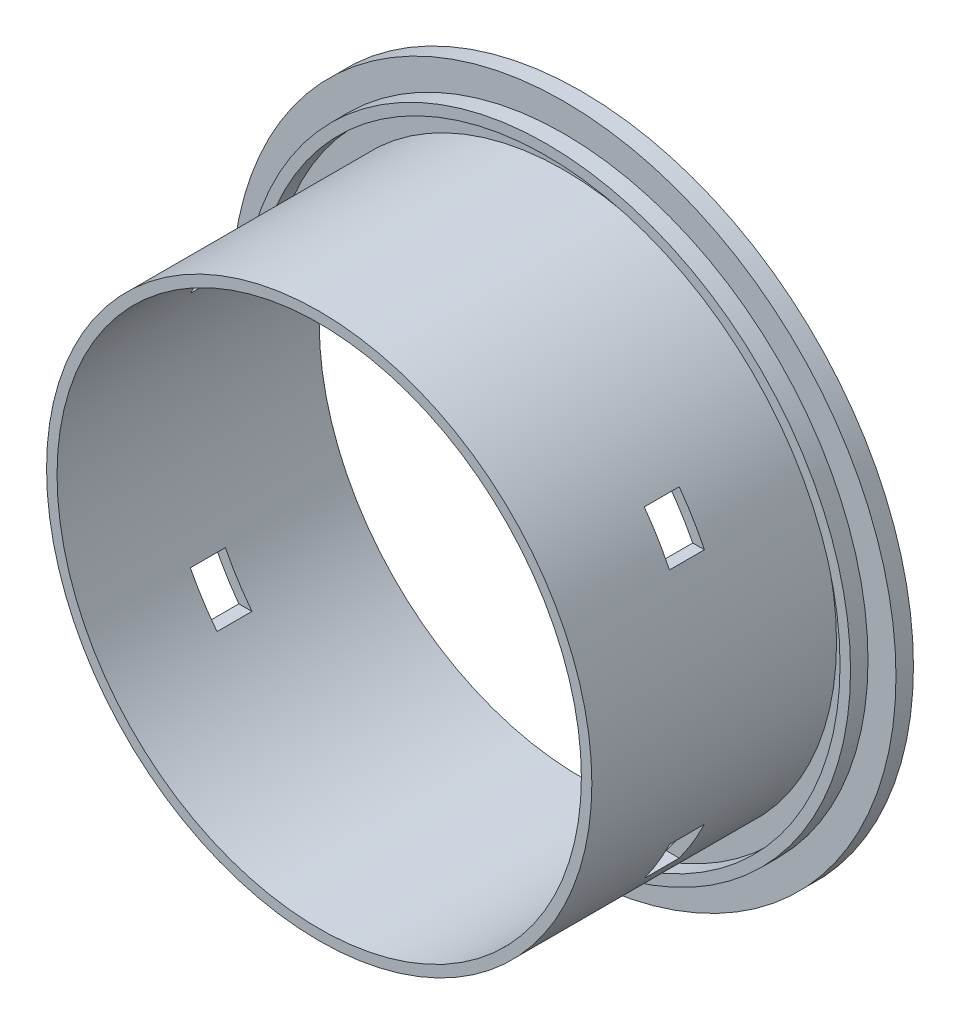
ISO-10303-21;
HEADER;
FILE_DESCRIPTION(('STEP AP214'),'2;1');
FILE_NAME('part.step','',(''),(''),'','','');
FILE_SCHEMA(('AUTOMOTIVE_DESIGN { 1 0 10303 214 1 1 1 1 }'));
ENDSEC;
DATA;
#1=APPLICATION_CONTEXT('core data for automotive mechanical design processes');
#2=APPLICATION_PROTOCOL_DEFINITION('international standard','automotive_design',2000,#1);
#3=PRODUCT_CONTEXT('',#1,'mechanical');
#4=PRODUCT('Part','Part','',(#3));
#5=PRODUCT_RELATED_PRODUCT_CATEGORY('part','',(#4));
#6=PRODUCT_DEFINITION_FORMATION('','',#4);
#7=PRODUCT_DEFINITION_CONTEXT('part definition',#1,'design');
#8=PRODUCT_DEFINITION('design','',#6,#7);
#9=PRODUCT_DEFINITION_SHAPE('','',#8);
#10=(LENGTH_UNIT() NAMED_UNIT(*) SI_UNIT(.MILLI.,.METRE.));
#11=(NAMED_UNIT(*) PLANE_ANGLE_UNIT() SI_UNIT($,.RADIAN.));
#12=(NAMED_UNIT(*) SI_UNIT($,.STERADIAN.) SOLID_ANGLE_UNIT());
#13=UNCERTAINTY_MEASURE_WITH_UNIT(LENGTH_MEASURE(1.E-05),#10,'distance_accuracy_value','');
#14=(GEOMETRIC_REPRESENTATION_CONTEXT(3) GLOBAL_UNCERTAINTY_ASSIGNED_CONTEXT((#13)) GLOBAL_UNIT_ASSIGNED_CONTEXT((#10,
#11,#12)) REPRESENTATION_CONTEXT('',''));
#15=CARTESIAN_POINT('',(0.,0.,0.));
#16=DIRECTION('',(0.,0.,1.));
#17=DIRECTION('',(1.,0.,0.));
#18=AXIS2_PLACEMENT_3D('',#15,#16,#17);
#19=CARTESIAN_POINT('',(0.,0.,5.));
#20=DIRECTION('',(0.,0.,1.));
#21=DIRECTION('',(1.,0.,0.));
#22=AXIS2_PLACEMENT_3D('',#19,#20,#21);
#23=PLANE('',#22);
#24=CARTESIAN_POINT('',(0.,0.,5.));
#25=DIRECTION('',(0.,0.,1.));
#26=DIRECTION('',(1.,0.,0.));
#27=AXIS2_PLACEMENT_3D('',#24,#25,#26);
#28=CIRCLE('',#27,84.);
#29=CARTESIAN_POINT('',(84.,0.,5.));
#30=VERTEX_POINT('',#29);
#31=EDGE_CURVE('E230',#30,#30,#28,.F.);
#32=ORIENTED_EDGE('',*,*,#31,.F.);
#33=EDGE_LOOP('',(#32));
#34=FACE_BOUND('',#33,.T.);
#35=CARTESIAN_POINT('',(0.,0.,5.));
#36=DIRECTION('',(0.,0.,1.));
#37=DIRECTION('',(1.,0.,0.));
#38=AXIS2_PLACEMENT_3D('',#35,#36,#37);
#39=CIRCLE('',#38,78.);
#40=CARTESIAN_POINT('',(78.,0.,5.));
#41=VERTEX_POINT('',#40);
#42=EDGE_CURVE('E217',#41,#41,#39,.T.);
#43=ORIENTED_EDGE('',*,*,#42,.F.);
#44=EDGE_LOOP('',(#43));
#45=FACE_BOUND('',#44,.T.);
#46=ADVANCED_FACE('F37',(#34,#45),#23,.T.);
#47=CARTESIAN_POINT('',(0.,0.,5.));
#48=DIRECTION('',(0.,0.,1.));
#49=DIRECTION('',(1.,0.,0.));
#50=AXIS2_PLACEMENT_3D('',#47,#48,#49);
#51=CIRCLE('',#50,87.);
#52=CARTESIAN_POINT('',(87.,0.,5.));
#53=VERTEX_POINT('',#52);
#54=EDGE_CURVE('E229',#53,#53,#51,.F.);
#55=ORIENTED_EDGE('',*,*,#54,.T.);
#56=EDGE_LOOP('',(#55));
#57=FACE_BOUND('',#56,.T.);
#58=CARTESIAN_POINT('',(0.,0.,5.));
#59=DIRECTION('',(0.,0.,1.));
#60=DIRECTION('',(1.,0.,0.));
#61=AXIS2_PLACEMENT_3D('',#58,#59,#60);
#62=CIRCLE('',#61,95.);
#63=CARTESIAN_POINT('',(95.,0.,5.));
#64=VERTEX_POINT('',#63);
#65=EDGE_CURVE('E234',#64,#64,#62,.T.);
#66=ORIENTED_EDGE('',*,*,#65,.T.);
#67=EDGE_LOOP('',(#66));
#68=FACE_BOUND('',#67,.T.);
#69=ADVANCED_FACE('F314',(#57,#68),#23,.T.);
#70=CARTESIAN_POINT('',(0.,0.,0.));
#71=DIRECTION('',(0.,0.,1.));
#72=DIRECTION('',(1.,0.,0.));
#73=AXIS2_PLACEMENT_3D('',#70,#71,#72);
#74=PLANE('',#73);
#75=CARTESIAN_POINT('',(0.,0.,0.));
#76=DIRECTION('',(0.,0.,1.));
#77=DIRECTION('',(1.,0.,0.));
#78=AXIS2_PLACEMENT_3D('',#75,#76,#77);
#79=CIRCLE('',#78,95.);
#80=CARTESIAN_POINT('',(95.,0.,0.));
#81=VERTEX_POINT('',#80);
#82=EDGE_CURVE('E240',#81,#81,#79,.T.);
#83=ORIENTED_EDGE('',*,*,#82,.F.);
#84=EDGE_LOOP('',(#83));
#85=FACE_BOUND('',#84,.T.);
#86=CARTESIAN_POINT('',(0.,0.,0.));
#87=DIRECTION('',(0.,0.,1.));
#88=DIRECTION('',(1.,0.,0.));
#89=AXIS2_PLACEMENT_3D('',#86,#87,#88);
#90=CIRCLE('',#89,75.);
#91=CARTESIAN_POINT('',(75.,0.,0.));
#92=VERTEX_POINT('',#91);
#93=EDGE_CURVE('E237',#92,#92,#90,.T.);
#94=ORIENTED_EDGE('',*,*,#93,.T.);
#95=EDGE_LOOP('',(#94));
#96=FACE_BOUND('',#95,.T.);
#97=ADVANCED_FACE('F320',(#85,#96),#74,.F.);
#98=CARTESIAN_POINT('',(0.,0.,5.));
#99=DIRECTION('',(0.,0.,-1.));
#100=DIRECTION('',(-1.,0.,0.));
#101=AXIS2_PLACEMENT_3D('',#98,#99,#100);
#102=CYLINDRICAL_SURFACE('',#101,95.);
#103=ORIENTED_EDGE('',*,*,#65,.F.);
#104=EDGE_LOOP('',(#103));
#105=FACE_BOUND('',#104,.T.);
#106=ORIENTED_EDGE('',*,*,#82,.T.);
#107=EDGE_LOOP('',(#106));
#108=FACE_BOUND('',#107,.T.);
#109=ADVANCED_FACE('F39',(#105,#108),#102,.T.);
#110=CARTESIAN_POINT('',(0.,0.,5.));
#111=DIRECTION('',(0.,0.,-1.));
#112=DIRECTION('',(-1.,0.,0.));
#113=AXIS2_PLACEMENT_3D('',#110,#111,#112);
#114=CYLINDRICAL_SURFACE('',#113,75.);
#115=CARTESIAN_POINT('',(0.,0.,35.));
#116=DIRECTION('',(0.,0.,-1.));
#117=DIRECTION('',(-1.,0.,0.));
#118=AXIS2_PLACEMENT_3D('',#115,#116,#117);
#119=CIRCLE('',#118,75.);
#120=CARTESIAN_POINT('',(66.8505796534331,-34.,35.));
#121=VERTEX_POINT('',#120);
#122=CARTESIAN_POINT('',(59.2368128784796,-46.,35.));
#123=VERTEX_POINT('',#122);
#124=EDGE_CURVE('E184',#121,#123,#119,.T.);
#125=ORIENTED_EDGE('',*,*,#124,.F.);
#126=DIRECTION('',(0.,0.,-1.));
#127=VECTOR('',#126,1.);
#128=CARTESIAN_POINT('',(66.8505796534331,-34.,5.));
#129=LINE('',#128,#127);
#130=CARTESIAN_POINT('',(66.8505796534331,-34.,45.));
#131=VERTEX_POINT('',#130);
#132=EDGE_CURVE('E158',#131,#121,#129,.T.);
#133=ORIENTED_EDGE('',*,*,#132,.F.);
#134=CARTESIAN_POINT('',(0.,0.,45.));
#135=DIRECTION('',(0.,0.,1.));
#136=DIRECTION('',(1.,0.,0.));
#137=AXIS2_PLACEMENT_3D('',#134,#135,#136);
#138=CIRCLE('',#137,75.);
#139=CARTESIAN_POINT('',(59.2368128784796,-46.,45.));
#140=VERTEX_POINT('',#139);
#141=EDGE_CURVE('E176',#140,#131,#138,.T.);
#142=ORIENTED_EDGE('',*,*,#141,.F.);
#143=DIRECTION('',(0.,0.,-1.));
#144=VECTOR('',#143,1.);
#145=CARTESIAN_POINT('',(59.2368128784796,-46.,5.));
#146=LINE('',#145,#144);
#147=EDGE_CURVE('E175',#123,#140,#146,.F.);
#148=ORIENTED_EDGE('',*,*,#147,.F.);
#149=EDGE_LOOP('',(#125,#133,#142,#148));
#150=FACE_BOUND('',#149,.T.);
#151=CARTESIAN_POINT('',(-59.2368128784796,-46.,35.));
#152=VERTEX_POINT('',#151);
#153=CARTESIAN_POINT('',(-66.8505796534331,-34.,35.));
#154=VERTEX_POINT('',#153);
#155=EDGE_CURVE('E182',#152,#154,#119,.T.);
#156=ORIENTED_EDGE('',*,*,#155,.F.);
#157=DIRECTION('',(0.,0.,-1.));
#158=VECTOR('',#157,1.);
#159=CARTESIAN_POINT('',(-59.2368128784796,-46.,5.));
#160=LINE('',#159,#158);
#161=CARTESIAN_POINT('',(-59.2368128784796,-46.,45.));
#162=VERTEX_POINT('',#161);
#163=EDGE_CURVE('E174',#162,#152,#160,.T.);
#164=ORIENTED_EDGE('',*,*,#163,.F.);
#165=CARTESIAN_POINT('',(-66.8505796534331,-34.,45.));
#166=VERTEX_POINT('',#165);
#167=EDGE_CURVE('E164',#166,#162,#138,.T.);
#168=ORIENTED_EDGE('',*,*,#167,.F.);
#169=DIRECTION('',(0.,0.,-1.));
#170=VECTOR('',#169,1.);
#171=CARTESIAN_POINT('',(-66.8505796534331,-34.,5.));
#172=LINE('',#171,#170);
#173=EDGE_CURVE('E150',#154,#166,#172,.F.);
#174=ORIENTED_EDGE('',*,*,#173,.F.);
#175=EDGE_LOOP('',(#156,#164,#168,#174));
#176=FACE_BOUND('',#175,.T.);
#177=CARTESIAN_POINT('',(0.,0.,35.));
#178=DIRECTION('',(0.,0.,-1.));
#179=DIRECTION('',(-1.,0.,0.));
#180=AXIS2_PLACEMENT_3D('',#177,#178,#179);
#181=CIRCLE('',#180,75.);
#182=CARTESIAN_POINT('',(59.2368128784796,46.,35.));
#183=VERTEX_POINT('',#182);
#184=CARTESIAN_POINT('',(66.8505796534331,34.,35.));
#185=VERTEX_POINT('',#184);
#186=EDGE_CURVE('E211',#183,#185,#181,.T.);
#187=ORIENTED_EDGE('',*,*,#186,.F.);
#188=DIRECTION('',(0.,0.,-1.));
#189=VECTOR('',#188,1.);
#190=CARTESIAN_POINT('',(59.2368128784796,46.,5.));
#191=LINE('',#190,#189);
#192=CARTESIAN_POINT('',(59.2368128784796,46.,45.));
#193=VERTEX_POINT('',#192);
#194=EDGE_CURVE('E202',#193,#183,#191,.T.);
#195=ORIENTED_EDGE('',*,*,#194,.F.);
#196=CARTESIAN_POINT('',(0.,0.,45.));
#197=DIRECTION('',(0.,0.,1.));
#198=DIRECTION('',(1.,0.,0.));
#199=AXIS2_PLACEMENT_3D('',#196,#197,#198);
#200=CIRCLE('',#199,75.);
#201=CARTESIAN_POINT('',(66.8505796534331,34.,45.));
#202=VERTEX_POINT('',#201);
#203=EDGE_CURVE('E206',#202,#193,#200,.T.);
#204=ORIENTED_EDGE('',*,*,#203,.F.);
#205=DIRECTION('',(0.,0.,-1.));
#206=VECTOR('',#205,1.);
#207=CARTESIAN_POINT('',(66.8505796534331,34.,5.));
#208=LINE('',#207,#206);
#209=EDGE_CURVE('E207',#185,#202,#208,.F.);
#210=ORIENTED_EDGE('',*,*,#209,.F.);
#211=EDGE_LOOP('',(#187,#195,#204,#210));
#212=FACE_BOUND('',#211,.T.);
#213=CARTESIAN_POINT('',(-66.8505796534331,34.,35.));
#214=VERTEX_POINT('',#213);
#215=CARTESIAN_POINT('',(-59.2368128784796,46.,35.));
#216=VERTEX_POINT('',#215);
#217=EDGE_CURVE('E213',#214,#216,#181,.T.);
#218=ORIENTED_EDGE('',*,*,#217,.F.);
#219=DIRECTION('',(0.,0.,-1.));
#220=VECTOR('',#219,1.);
#221=CARTESIAN_POINT('',(-66.8505796534331,34.,5.));
#222=LINE('',#221,#220);
#223=CARTESIAN_POINT('',(-66.8505796534331,34.,45.));
#224=VERTEX_POINT('',#223);
#225=EDGE_CURVE('E209',#224,#214,#222,.T.);
#226=ORIENTED_EDGE('',*,*,#225,.F.);
#227=CARTESIAN_POINT('',(-59.2368128784796,46.,45.));
#228=VERTEX_POINT('',#227);
#229=EDGE_CURVE('E204',#228,#224,#200,.T.);
#230=ORIENTED_EDGE('',*,*,#229,.F.);
#231=DIRECTION('',(0.,0.,-1.));
#232=VECTOR('',#231,1.);
#233=CARTESIAN_POINT('',(-59.2368128784796,46.,5.));
#234=LINE('',#233,#232);
#235=EDGE_CURVE('E200',#216,#228,#234,.F.);
#236=ORIENTED_EDGE('',*,*,#235,.F.);
#237=EDGE_LOOP('',(#218,#226,#230,#236));
#238=FACE_BOUND('',#237,.T.);
#239=ORIENTED_EDGE('',*,*,#93,.F.);
#240=EDGE_LOOP('',(#239));
#241=FACE_BOUND('',#240,.T.);
#242=CARTESIAN_POINT('',(0.,0.,75.));
#243=DIRECTION('',(0.,0.,1.));
#244=DIRECTION('',(1.,0.,0.));
#245=AXIS2_PLACEMENT_3D('',#242,#243,#244);
#246=CIRCLE('',#245,75.);
#247=CARTESIAN_POINT('',(75.,0.,75.));
#248=VERTEX_POINT('',#247);
#249=EDGE_CURVE('E214',#248,#248,#246,.T.);
#250=ORIENTED_EDGE('',*,*,#249,.T.);
#251=EDGE_LOOP('',(#250));
#252=FACE_BOUND('',#251,.T.);
#253=ADVANCED_FACE('F172',(#150,#176,#212,#238,#241,#252),#114,.F.);
#254=CARTESIAN_POINT('',(0.,0.,10.));
#255=DIRECTION('',(0.,0.,1.));
#256=DIRECTION('',(1.,0.,0.));
#257=AXIS2_PLACEMENT_3D('',#254,#255,#256);
#258=PLANE('',#257);
#259=CARTESIAN_POINT('',(0.,0.,10.));
#260=DIRECTION('',(0.,0.,1.));
#261=DIRECTION('',(1.,0.,0.));
#262=AXIS2_PLACEMENT_3D('',#259,#260,#261);
#263=CIRCLE('',#262,87.);
#264=CARTESIAN_POINT('',(87.,0.,10.));
#265=VERTEX_POINT('',#264);
#266=EDGE_CURVE('E226',#265,#265,#263,.T.);
#267=ORIENTED_EDGE('',*,*,#266,.T.);
#268=EDGE_LOOP('',(#267));
#269=FACE_BOUND('',#268,.T.);
#270=CARTESIAN_POINT('',(0.,0.,10.));
#271=DIRECTION('',(0.,0.,1.));
#272=DIRECTION('',(1.,0.,0.));
#273=AXIS2_PLACEMENT_3D('',#270,#271,#272);
#274=CIRCLE('',#273,84.);
#275=CARTESIAN_POINT('',(84.,0.,10.));
#276=VERTEX_POINT('',#275);
#277=EDGE_CURVE('E221',#276,#276,#274,.T.);
#278=ORIENTED_EDGE('',*,*,#277,.F.);
#279=EDGE_LOOP('',(#278));
#280=FACE_BOUND('',#279,.T.);
#281=ADVANCED_FACE('F338',(#269,#280),#258,.T.);
#282=CARTESIAN_POINT('',(0.,0.,10.));
#283=DIRECTION('',(0.,0.,-1.));
#284=DIRECTION('',(-1.,0.,0.));
#285=AXIS2_PLACEMENT_3D('',#282,#283,#284);
#286=CYLINDRICAL_SURFACE('',#285,87.);
#287=ORIENTED_EDGE('',*,*,#54,.F.);
#288=EDGE_LOOP('',(#287));
#289=FACE_BOUND('',#288,.T.);
#290=ORIENTED_EDGE('',*,*,#266,.F.);
#291=EDGE_LOOP('',(#290));
#292=FACE_BOUND('',#291,.T.);
#293=ADVANCED_FACE('F352',(#289,#292),#286,.T.);
#294=CARTESIAN_POINT('',(0.,0.,10.));
#295=DIRECTION('',(0.,0.,-1.));
#296=DIRECTION('',(-1.,0.,0.));
#297=AXIS2_PLACEMENT_3D('',#294,#295,#296);
#298=CYLINDRICAL_SURFACE('',#297,84.);
#299=ORIENTED_EDGE('',*,*,#31,.T.);
#300=EDGE_LOOP('',(#299));
#301=FACE_BOUND('',#300,.T.);
#302=ORIENTED_EDGE('',*,*,#277,.T.);
#303=EDGE_LOOP('',(#302));
#304=FACE_BOUND('',#303,.T.);
#305=ADVANCED_FACE('F343',(#301,#304),#298,.F.);
#306=CARTESIAN_POINT('',(0.,0.,75.));
#307=DIRECTION('',(0.,0.,1.));
#308=DIRECTION('',(1.,0.,0.));
#309=AXIS2_PLACEMENT_3D('',#306,#307,#308);
#310=PLANE('',#309);
#311=CARTESIAN_POINT('',(0.,0.,75.));
#312=DIRECTION('',(0.,0.,1.));
#313=DIRECTION('',(1.,0.,0.));
#314=AXIS2_PLACEMENT_3D('',#311,#312,#313);
#315=CIRCLE('',#314,78.);
#316=CARTESIAN_POINT('',(78.,0.,75.));
#317=VERTEX_POINT('',#316);
#318=EDGE_CURVE('E218',#317,#317,#315,.T.);
#319=ORIENTED_EDGE('',*,*,#318,.T.);
#320=EDGE_LOOP('',(#319));
#321=FACE_BOUND('',#320,.T.);
#322=ORIENTED_EDGE('',*,*,#249,.F.);
#323=EDGE_LOOP('',(#322));
#324=FACE_BOUND('',#323,.T.);
#325=ADVANCED_FACE('F341',(#321,#324),#310,.T.);
#326=CARTESIAN_POINT('',(0.,0.,75.));
#327=DIRECTION('',(0.,0.,-1.));
#328=DIRECTION('',(-1.,0.,0.));
#329=AXIS2_PLACEMENT_3D('',#326,#327,#328);
#330=CYLINDRICAL_SURFACE('',#329,78.);
#331=DIRECTION('',(0.,0.,-1.));
#332=VECTOR('',#331,1.);
#333=CARTESIAN_POINT('',(70.199715099137,-34.,75.));
#334=LINE('',#333,#332);
#335=CARTESIAN_POINT('',(70.199715099137,-34.,45.));
#336=VERTEX_POINT('',#335);
#337=CARTESIAN_POINT('',(70.199715099137,-34.,35.));
#338=VERTEX_POINT('',#337);
#339=EDGE_CURVE('E271',#336,#338,#334,.T.);
#340=ORIENTED_EDGE('',*,*,#339,.T.);
#341=CARTESIAN_POINT('',(0.,0.,35.));
#342=DIRECTION('',(0.,0.,-1.));
#343=DIRECTION('',(-1.,0.,0.));
#344=AXIS2_PLACEMENT_3D('',#341,#342,#343);
#345=CIRCLE('',#344,78.);
#346=CARTESIAN_POINT('',(62.9920629920945,-46.,35.));
#347=VERTEX_POINT('',#346);
#348=EDGE_CURVE('E11',#338,#347,#345,.T.);
#349=ORIENTED_EDGE('',*,*,#348,.T.);
#350=DIRECTION('',(0.,0.,-1.));
#351=VECTOR('',#350,1.);
#352=CARTESIAN_POINT('',(62.9920629920945,-46.,75.));
#353=LINE('',#352,#351);
#354=CARTESIAN_POINT('',(62.9920629920945,-46.,45.));
#355=VERTEX_POINT('',#354);
#356=EDGE_CURVE('E41',#347,#355,#353,.F.);
#357=ORIENTED_EDGE('',*,*,#356,.T.);
#358=CARTESIAN_POINT('',(0.,0.,45.));
#359=DIRECTION('',(0.,0.,1.));
#360=DIRECTION('',(1.,0.,0.));
#361=AXIS2_PLACEMENT_3D('',#358,#359,#360);
#362=CIRCLE('',#361,78.);
#363=EDGE_CURVE('E268',#355,#336,#362,.T.);
#364=ORIENTED_EDGE('',*,*,#363,.T.);
#365=EDGE_LOOP('',(#340,#349,#357,#364));
#366=FACE_BOUND('',#365,.T.);
#367=DIRECTION('',(0.,0.,-1.));
#368=VECTOR('',#367,1.);
#369=CARTESIAN_POINT('',(-62.9920629920945,-46.,75.));
#370=LINE('',#369,#368);
#371=CARTESIAN_POINT('',(-62.9920629920945,-46.,45.));
#372=VERTEX_POINT('',#371);
#373=CARTESIAN_POINT('',(-62.9920629920945,-46.,35.));
#374=VERTEX_POINT('',#373);
#375=EDGE_CURVE('E267',#372,#374,#370,.T.);
#376=ORIENTED_EDGE('',*,*,#375,.T.);
#377=CARTESIAN_POINT('',(-70.199715099137,-34.,35.));
#378=VERTEX_POINT('',#377);
#379=EDGE_CURVE('E47',#374,#378,#345,.T.);
#380=ORIENTED_EDGE('',*,*,#379,.T.);
#381=DIRECTION('',(0.,0.,-1.));
#382=VECTOR('',#381,1.);
#383=CARTESIAN_POINT('',(-70.199715099137,-34.,75.));
#384=LINE('',#383,#382);
#385=CARTESIAN_POINT('',(-70.199715099137,-34.,45.));
#386=VERTEX_POINT('',#385);
#387=EDGE_CURVE('E264',#378,#386,#384,.F.);
#388=ORIENTED_EDGE('',*,*,#387,.T.);
#389=EDGE_CURVE('E167',#386,#372,#362,.T.);
#390=ORIENTED_EDGE('',*,*,#389,.T.);
#391=EDGE_LOOP('',(#376,#380,#388,#390));
#392=FACE_BOUND('',#391,.T.);
#393=DIRECTION('',(0.,0.,-1.));
#394=VECTOR('',#393,1.);
#395=CARTESIAN_POINT('',(62.9920629920945,46.,75.));
#396=LINE('',#395,#394);
#397=CARTESIAN_POINT('',(62.9920629920945,46.,45.));
#398=VERTEX_POINT('',#397);
#399=CARTESIAN_POINT('',(62.9920629920945,46.,35.));
#400=VERTEX_POINT('',#399);
#401=EDGE_CURVE('E257',#398,#400,#396,.T.);
#402=ORIENTED_EDGE('',*,*,#401,.T.);
#403=CARTESIAN_POINT('',(0.,0.,35.));
#404=DIRECTION('',(0.,0.,-1.));
#405=DIRECTION('',(-1.,0.,0.));
#406=AXIS2_PLACEMENT_3D('',#403,#404,#405);
#407=CIRCLE('',#406,78.);
#408=CARTESIAN_POINT('',(70.199715099137,34.,35.));
#409=VERTEX_POINT('',#408);
#410=EDGE_CURVE('E258',#400,#409,#407,.T.);
#411=ORIENTED_EDGE('',*,*,#410,.T.);
#412=DIRECTION('',(0.,0.,-1.));
#413=VECTOR('',#412,1.);
#414=CARTESIAN_POINT('',(70.199715099137,34.,75.));
#415=LINE('',#414,#413);
#416=CARTESIAN_POINT('',(70.199715099137,34.,45.));
#417=VERTEX_POINT('',#416);
#418=EDGE_CURVE('E261',#409,#417,#415,.F.);
#419=ORIENTED_EDGE('',*,*,#418,.T.);
#420=CARTESIAN_POINT('',(0.,0.,45.));
#421=DIRECTION('',(0.,0.,1.));
#422=DIRECTION('',(1.,0.,0.));
#423=AXIS2_PLACEMENT_3D('',#420,#421,#422);
#424=CIRCLE('',#423,78.);
#425=EDGE_CURVE('E251',#417,#398,#424,.T.);
#426=ORIENTED_EDGE('',*,*,#425,.T.);
#427=EDGE_LOOP('',(#402,#411,#419,#426));
#428=FACE_BOUND('',#427,.T.);
#429=DIRECTION('',(0.,0.,-1.));
#430=VECTOR('',#429,1.);
#431=CARTESIAN_POINT('',(-70.199715099137,34.,75.));
#432=LINE('',#431,#430);
#433=CARTESIAN_POINT('',(-70.199715099137,34.,45.));
#434=VERTEX_POINT('',#433);
#435=CARTESIAN_POINT('',(-70.199715099137,34.,35.));
#436=VERTEX_POINT('',#435);
#437=EDGE_CURVE('E250',#434,#436,#432,.T.);
#438=ORIENTED_EDGE('',*,*,#437,.T.);
#439=CARTESIAN_POINT('',(-62.9920629920945,46.,35.));
#440=VERTEX_POINT('',#439);
#441=EDGE_CURVE('E254',#436,#440,#407,.T.);
#442=ORIENTED_EDGE('',*,*,#441,.T.);
#443=DIRECTION('',(0.,0.,-1.));
#444=VECTOR('',#443,1.);
#445=CARTESIAN_POINT('',(-62.9920629920945,46.,75.));
#446=LINE('',#445,#444);
#447=CARTESIAN_POINT('',(-62.9920629920945,46.,45.));
#448=VERTEX_POINT('',#447);
#449=EDGE_CURVE('E233',#440,#448,#446,.F.);
#450=ORIENTED_EDGE('',*,*,#449,.T.);
#451=EDGE_CURVE('E247',#448,#434,#424,.T.);
#452=ORIENTED_EDGE('',*,*,#451,.T.);
#453=EDGE_LOOP('',(#438,#442,#450,#452));
#454=FACE_BOUND('',#453,.T.);
#455=ORIENTED_EDGE('',*,*,#318,.F.);
#456=EDGE_LOOP('',(#455));
#457=FACE_BOUND('',#456,.T.);
#458=ORIENTED_EDGE('',*,*,#42,.T.);
#459=EDGE_LOOP('',(#458));
#460=FACE_BOUND('',#459,.T.);
#461=ADVANCED_FACE('F276',(#366,#392,#428,#454,#457,#460),#330,.T.);
#462=CARTESIAN_POINT('',(-95.,46.,45.));
#463=DIRECTION('',(0.,1.,0.));
#464=DIRECTION('',(0.,0.,1.));
#465=AXIS2_PLACEMENT_3D('',#462,#463,#464);
#466=PLANE('',#465);
#467=ORIENTED_EDGE('',*,*,#235,.T.);
#468=DIRECTION('',(1.,0.,0.));
#469=VECTOR('',#468,1.);
#470=CARTESIAN_POINT('',(-95.,46.,45.));
#471=LINE('',#470,#469);
#472=EDGE_CURVE('E193',#448,#228,#471,.T.);
#473=ORIENTED_EDGE('',*,*,#472,.F.);
#474=ORIENTED_EDGE('',*,*,#449,.F.);
#475=DIRECTION('',(1.,0.,0.));
#476=VECTOR('',#475,1.);
#477=CARTESIAN_POINT('',(-95.,46.,35.));
#478=LINE('',#477,#476);
#479=EDGE_CURVE('E197',#440,#216,#478,.T.);
#480=ORIENTED_EDGE('',*,*,#479,.T.);
#481=EDGE_LOOP('',(#467,#473,#474,#480));
#482=FACE_BOUND('',#481,.T.);
#483=ADVANCED_FACE('F350',(#482),#466,.F.);
#484=CARTESIAN_POINT('',(-95.,46.,45.));
#485=DIRECTION('',(0.,0.,1.));
#486=DIRECTION('',(1.,0.,0.));
#487=AXIS2_PLACEMENT_3D('',#484,#485,#486);
#488=PLANE('',#487);
#489=ORIENTED_EDGE('',*,*,#229,.T.);
#490=DIRECTION('',(1.,0.,0.));
#491=VECTOR('',#490,1.);
#492=CARTESIAN_POINT('',(-95.,34.,45.));
#493=LINE('',#492,#491);
#494=EDGE_CURVE('E189',#434,#224,#493,.T.);
#495=ORIENTED_EDGE('',*,*,#494,.F.);
#496=ORIENTED_EDGE('',*,*,#451,.F.);
#497=ORIENTED_EDGE('',*,*,#472,.T.);
#498=EDGE_LOOP('',(#489,#495,#496,#497));
#499=FACE_BOUND('',#498,.T.);
#500=ADVANCED_FACE('F402',(#499),#488,.F.);
#501=CARTESIAN_POINT('',(-95.,34.,45.));
#502=DIRECTION('',(0.,-1.,0.));
#503=DIRECTION('',(0.,0.,-1.));
#504=AXIS2_PLACEMENT_3D('',#501,#502,#503);
#505=PLANE('',#504);
#506=ORIENTED_EDGE('',*,*,#225,.T.);
#507=DIRECTION('',(1.,0.,0.));
#508=VECTOR('',#507,1.);
#509=CARTESIAN_POINT('',(-95.,34.,35.));
#510=LINE('',#509,#508);
#511=EDGE_CURVE('E188',#436,#214,#510,.T.);
#512=ORIENTED_EDGE('',*,*,#511,.F.);
#513=ORIENTED_EDGE('',*,*,#437,.F.);
#514=ORIENTED_EDGE('',*,*,#494,.T.);
#515=EDGE_LOOP('',(#506,#512,#513,#514));
#516=FACE_BOUND('',#515,.T.);
#517=ADVANCED_FACE('F413',(#516),#505,.F.);
#518=CARTESIAN_POINT('',(-95.,46.,35.));
#519=DIRECTION('',(0.,0.,-1.));
#520=DIRECTION('',(-1.,0.,0.));
#521=AXIS2_PLACEMENT_3D('',#518,#519,#520);
#522=PLANE('',#521);
#523=ORIENTED_EDGE('',*,*,#217,.T.);
#524=ORIENTED_EDGE('',*,*,#479,.F.);
#525=ORIENTED_EDGE('',*,*,#441,.F.);
#526=ORIENTED_EDGE('',*,*,#511,.T.);
#527=EDGE_LOOP('',(#523,#524,#525,#526));
#528=FACE_BOUND('',#527,.T.);
#529=ADVANCED_FACE('F356',(#528),#522,.F.);
#530=ORIENTED_EDGE('',*,*,#186,.T.);
#531=EDGE_CURVE('E185',#185,#409,#510,.T.);
#532=ORIENTED_EDGE('',*,*,#531,.T.);
#533=ORIENTED_EDGE('',*,*,#410,.F.);
#534=EDGE_CURVE('E198',#183,#400,#478,.T.);
#535=ORIENTED_EDGE('',*,*,#534,.F.);
#536=EDGE_LOOP('',(#530,#532,#533,#535));
#537=FACE_BOUND('',#536,.T.);
#538=ADVANCED_FACE('F436',(#537),#522,.F.);
#539=ORIENTED_EDGE('',*,*,#209,.T.);
#540=EDGE_CURVE('E190',#202,#417,#493,.T.);
#541=ORIENTED_EDGE('',*,*,#540,.T.);
#542=ORIENTED_EDGE('',*,*,#418,.F.);
#543=ORIENTED_EDGE('',*,*,#531,.F.);
#544=EDGE_LOOP('',(#539,#541,#542,#543));
#545=FACE_BOUND('',#544,.T.);
#546=ADVANCED_FACE('F427',(#545),#505,.F.);
#547=ORIENTED_EDGE('',*,*,#203,.T.);
#548=EDGE_CURVE('E194',#193,#398,#471,.T.);
#549=ORIENTED_EDGE('',*,*,#548,.T.);
#550=ORIENTED_EDGE('',*,*,#425,.F.);
#551=ORIENTED_EDGE('',*,*,#540,.F.);
#552=EDGE_LOOP('',(#547,#549,#550,#551));
#553=FACE_BOUND('',#552,.T.);
#554=ADVANCED_FACE('F416',(#553),#488,.F.);
#555=ORIENTED_EDGE('',*,*,#194,.T.);
#556=ORIENTED_EDGE('',*,*,#534,.T.);
#557=ORIENTED_EDGE('',*,*,#401,.F.);
#558=ORIENTED_EDGE('',*,*,#548,.F.);
#559=EDGE_LOOP('',(#555,#556,#557,#558));
#560=FACE_BOUND('',#559,.T.);
#561=ADVANCED_FACE('F404',(#560),#466,.F.);
#562=CARTESIAN_POINT('',(-95.,-34.,45.));
#563=DIRECTION('',(0.,1.,0.));
#564=DIRECTION('',(0.,0.,1.));
#565=AXIS2_PLACEMENT_3D('',#562,#563,#564);
#566=PLANE('',#565);
#567=ORIENTED_EDGE('',*,*,#173,.T.);
#568=DIRECTION('',(1.,0.,0.));
#569=VECTOR('',#568,1.);
#570=CARTESIAN_POINT('',(-95.,-34.,45.));
#571=LINE('',#570,#569);
#572=EDGE_CURVE('E153',#386,#166,#571,.T.);
#573=ORIENTED_EDGE('',*,*,#572,.F.);
#574=ORIENTED_EDGE('',*,*,#387,.F.);
#575=DIRECTION('',(1.,0.,0.));
#576=VECTOR('',#575,1.);
#577=CARTESIAN_POINT('',(-95.,-34.,35.));
#578=LINE('',#577,#576);
#579=EDGE_CURVE('E62',#378,#154,#578,.T.);
#580=ORIENTED_EDGE('',*,*,#579,.T.);
#581=EDGE_LOOP('',(#567,#573,#574,#580));
#582=FACE_BOUND('',#581,.T.);
#583=ADVANCED_FACE('F152',(#582),#566,.F.);
#584=CARTESIAN_POINT('',(-95.,-34.,45.));
#585=DIRECTION('',(0.,0.,1.));
#586=DIRECTION('',(1.,0.,0.));
#587=AXIS2_PLACEMENT_3D('',#584,#585,#586);
#588=PLANE('',#587);
#589=ORIENTED_EDGE('',*,*,#167,.T.);
#590=DIRECTION('',(1.,0.,0.));
#591=VECTOR('',#590,1.);
#592=CARTESIAN_POINT('',(-95.,-46.,45.));
#593=LINE('',#592,#591);
#594=EDGE_CURVE('E291',#372,#162,#593,.T.);
#595=ORIENTED_EDGE('',*,*,#594,.F.);
#596=ORIENTED_EDGE('',*,*,#389,.F.);
#597=ORIENTED_EDGE('',*,*,#572,.T.);
#598=EDGE_LOOP('',(#589,#595,#596,#597));
#599=FACE_BOUND('',#598,.T.);
#600=ADVANCED_FACE('F162',(#599),#588,.F.);
#601=CARTESIAN_POINT('',(-95.,-46.,45.));
#602=DIRECTION('',(0.,-1.,0.));
#603=DIRECTION('',(0.,0.,-1.));
#604=AXIS2_PLACEMENT_3D('',#601,#602,#603);
#605=PLANE('',#604);
#606=ORIENTED_EDGE('',*,*,#163,.T.);
#607=DIRECTION('',(1.,0.,0.));
#608=VECTOR('',#607,1.);
#609=CARTESIAN_POINT('',(-95.,-46.,35.));
#610=LINE('',#609,#608);
#611=EDGE_CURVE('E159',#374,#152,#610,.T.);
#612=ORIENTED_EDGE('',*,*,#611,.F.);
#613=ORIENTED_EDGE('',*,*,#375,.F.);
#614=ORIENTED_EDGE('',*,*,#594,.T.);
#615=EDGE_LOOP('',(#606,#612,#613,#614));
#616=FACE_BOUND('',#615,.T.);
#617=ADVANCED_FACE('F311',(#616),#605,.F.);
#618=CARTESIAN_POINT('',(-95.,-34.,35.));
#619=DIRECTION('',(0.,0.,-1.));
#620=DIRECTION('',(-1.,0.,0.));
#621=AXIS2_PLACEMENT_3D('',#618,#619,#620);
#622=PLANE('',#621);
#623=ORIENTED_EDGE('',*,*,#155,.T.);
#624=ORIENTED_EDGE('',*,*,#579,.F.);
#625=ORIENTED_EDGE('',*,*,#379,.F.);
#626=ORIENTED_EDGE('',*,*,#611,.T.);
#627=EDGE_LOOP('',(#623,#624,#625,#626));
#628=FACE_BOUND('',#627,.T.);
#629=ADVANCED_FACE('F509',(#628),#622,.F.);
#630=ORIENTED_EDGE('',*,*,#124,.T.);
#631=EDGE_CURVE('E284',#123,#347,#610,.T.);
#632=ORIENTED_EDGE('',*,*,#631,.T.);
#633=ORIENTED_EDGE('',*,*,#348,.F.);
#634=EDGE_CURVE('E296',#121,#338,#578,.T.);
#635=ORIENTED_EDGE('',*,*,#634,.F.);
#636=EDGE_LOOP('',(#630,#632,#633,#635));
#637=FACE_BOUND('',#636,.T.);
#638=ADVANCED_FACE('F288',(#637),#622,.F.);
#639=ORIENTED_EDGE('',*,*,#147,.T.);
#640=EDGE_CURVE('E169',#140,#355,#593,.T.);
#641=ORIENTED_EDGE('',*,*,#640,.T.);
#642=ORIENTED_EDGE('',*,*,#356,.F.);
#643=ORIENTED_EDGE('',*,*,#631,.F.);
#644=EDGE_LOOP('',(#639,#641,#642,#643));
#645=FACE_BOUND('',#644,.T.);
#646=ADVANCED_FACE('F283',(#645),#605,.F.);
#647=ORIENTED_EDGE('',*,*,#141,.T.);
#648=EDGE_CURVE('E54',#131,#336,#571,.T.);
#649=ORIENTED_EDGE('',*,*,#648,.T.);
#650=ORIENTED_EDGE('',*,*,#363,.F.);
#651=ORIENTED_EDGE('',*,*,#640,.F.);
#652=EDGE_LOOP('',(#647,#649,#650,#651));
#653=FACE_BOUND('',#652,.T.);
#654=ADVANCED_FACE('F302',(#653),#588,.F.);
#655=ORIENTED_EDGE('',*,*,#132,.T.);
#656=ORIENTED_EDGE('',*,*,#634,.T.);
#657=ORIENTED_EDGE('',*,*,#339,.F.);
#658=ORIENTED_EDGE('',*,*,#648,.F.);
#659=EDGE_LOOP('',(#655,#656,#657,#658));
#660=FACE_BOUND('',#659,.T.);
#661=ADVANCED_FACE('F297',(#660),#566,.F.);
#662=CLOSED_SHELL('',(#46,#69,#97,#109,#253,#281,#293,#305,#325,#461,#483,#500,#517,#529,#538,
#546,#554,#561,#583,#600,#617,#629,#638,#646,#654,#661));
#663=MANIFOLD_SOLID_BREP('B2',#662);
#664=ADVANCED_BREP_SHAPE_REPRESENTATION('',(#18,#663),#14);
#665=SHAPE_DEFINITION_REPRESENTATION(#9,#664);
ENDSEC;
END-ISO-10303-21;
